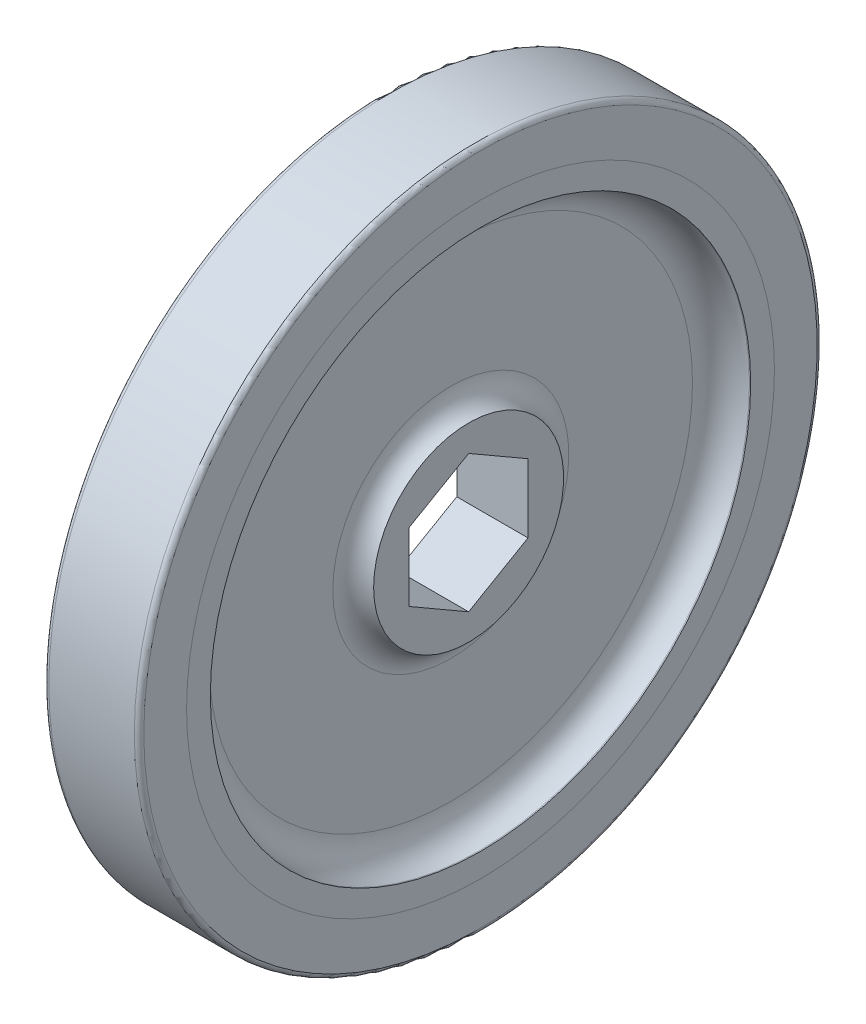
ISO-10303-21;
HEADER;
FILE_DESCRIPTION(('STEP AP214'),'2;1');
FILE_NAME('part.step','',(''),(''),'','','');
FILE_SCHEMA(('AUTOMOTIVE_DESIGN { 1 0 10303 214 1 1 1 1 }'));
ENDSEC;
DATA;
#1=APPLICATION_CONTEXT('core data for automotive mechanical design processes');
#2=APPLICATION_PROTOCOL_DEFINITION('international standard','automotive_design',2000,#1);
#3=PRODUCT_CONTEXT('',#1,'mechanical');
#4=PRODUCT('Part','Part','',(#3));
#5=PRODUCT_RELATED_PRODUCT_CATEGORY('part','',(#4));
#6=PRODUCT_DEFINITION_FORMATION('','',#4);
#7=PRODUCT_DEFINITION_CONTEXT('part definition',#1,'design');
#8=PRODUCT_DEFINITION('design','',#6,#7);
#9=PRODUCT_DEFINITION_SHAPE('','',#8);
#10=(LENGTH_UNIT() NAMED_UNIT(*) SI_UNIT(.MILLI.,.METRE.));
#11=(NAMED_UNIT(*) PLANE_ANGLE_UNIT() SI_UNIT($,.RADIAN.));
#12=(NAMED_UNIT(*) SI_UNIT($,.STERADIAN.) SOLID_ANGLE_UNIT());
#13=UNCERTAINTY_MEASURE_WITH_UNIT(LENGTH_MEASURE(1.E-05),#10,'distance_accuracy_value','');
#14=(GEOMETRIC_REPRESENTATION_CONTEXT(3) GLOBAL_UNCERTAINTY_ASSIGNED_CONTEXT((#13)) GLOBAL_UNIT_ASSIGNED_CONTEXT((#10,
#11,#12)) REPRESENTATION_CONTEXT('',''));
#15=CARTESIAN_POINT('',(0.,0.,0.));
#16=DIRECTION('',(0.,0.,1.));
#17=DIRECTION('',(1.,0.,0.));
#18=AXIS2_PLACEMENT_3D('',#15,#16,#17);
#19=CARTESIAN_POINT('',(-5.08,36.5125,0.));
#20=DIRECTION('',(1.,0.,0.));
#21=DIRECTION('',(0.,0.,-1.));
#22=AXIS2_PLACEMENT_3D('',#19,#20,#21);
#23=PLANE('',#22);
#24=CARTESIAN_POINT('',(-5.08,0.,0.));
#25=DIRECTION('',(1.,0.,0.));
#26=DIRECTION('',(0.,0.,-1.));
#27=AXIS2_PLACEMENT_3D('',#24,#25,#26);
#28=CIRCLE('',#27,36.0045);
#29=CARTESIAN_POINT('',(-5.08,0.,-36.0045));
#30=VERTEX_POINT('',#29);
#31=EDGE_CURVE('E58',#30,#30,#28,.F.);
#32=ORIENTED_EDGE('',*,*,#31,.T.);
#33=EDGE_LOOP('',(#32));
#34=FACE_BOUND('',#33,.T.);
#35=CARTESIAN_POINT('',(-5.08,0.,0.));
#36=DIRECTION('',(-1.,0.,0.));
#37=DIRECTION('',(0.,0.,1.));
#38=AXIS2_PLACEMENT_3D('',#35,#36,#37);
#39=CIRCLE('',#38,31.4325);
#40=CARTESIAN_POINT('',(-5.08,0.,31.4325));
#41=VERTEX_POINT('',#40);
#42=EDGE_CURVE('E63',#41,#41,#39,.T.);
#43=ORIENTED_EDGE('',*,*,#42,.F.);
#44=EDGE_LOOP('',(#43));
#45=FACE_BOUND('',#44,.T.);
#46=ADVANCED_FACE('F43',(#34,#45),#23,.F.);
#47=CARTESIAN_POINT('',(-3.81,0.,0.));
#48=DIRECTION('',(-1.,0.,0.));
#49=DIRECTION('',(0.,0.,1.));
#50=AXIS2_PLACEMENT_3D('',#47,#48,#49);
#51=CYLINDRICAL_SURFACE('',#50,31.4325);
#52=CARTESIAN_POINT('',(-2.54,0.,0.));
#53=DIRECTION('',(-1.,0.,0.));
#54=DIRECTION('',(0.,0.,1.));
#55=AXIS2_PLACEMENT_3D('',#52,#53,#54);
#56=CIRCLE('',#55,31.4325);
#57=CARTESIAN_POINT('',(-2.54,0.,31.4325));
#58=VERTEX_POINT('',#57);
#59=EDGE_CURVE('E66',#58,#58,#56,.T.);
#60=ORIENTED_EDGE('',*,*,#59,.F.);
#61=EDGE_LOOP('',(#60));
#62=FACE_BOUND('',#61,.T.);
#63=ORIENTED_EDGE('',*,*,#42,.T.);
#64=EDGE_LOOP('',(#63));
#65=FACE_BOUND('',#64,.T.);
#66=ADVANCED_FACE('F105',(#62,#65),#51,.F.);
#67=CARTESIAN_POINT('',(-2.54,31.4325,0.));
#68=DIRECTION('',(-1.,0.,0.));
#69=DIRECTION('',(0.,0.,1.));
#70=AXIS2_PLACEMENT_3D('',#67,#68,#69);
#71=PLANE('',#70);
#72=CARTESIAN_POINT('',(-2.54,0.,0.));
#73=DIRECTION('',(-1.,0.,0.));
#74=DIRECTION('',(0.,0.,1.));
#75=AXIS2_PLACEMENT_3D('',#72,#73,#74);
#76=CIRCLE('',#75,33.9725);
#77=CARTESIAN_POINT('',(-2.54,0.,33.9725));
#78=VERTEX_POINT('',#77);
#79=EDGE_CURVE('E69',#78,#78,#76,.T.);
#80=ORIENTED_EDGE('',*,*,#79,.F.);
#81=EDGE_LOOP('',(#80));
#82=FACE_BOUND('',#81,.T.);
#83=ORIENTED_EDGE('',*,*,#59,.T.);
#84=EDGE_LOOP('',(#83));
#85=FACE_BOUND('',#84,.T.);
#86=ADVANCED_FACE('F99',(#82,#85),#71,.F.);
#87=CARTESIAN_POINT('',(-3.81,0.,0.));
#88=DIRECTION('',(-1.,0.,0.));
#89=DIRECTION('',(0.,0.,1.));
#90=AXIS2_PLACEMENT_3D('',#87,#88,#89);
#91=CYLINDRICAL_SURFACE('',#90,33.9725);
#92=CARTESIAN_POINT('',(2.54,0.,0.));
#93=DIRECTION('',(-1.,0.,0.));
#94=DIRECTION('',(0.,0.,1.));
#95=AXIS2_PLACEMENT_3D('',#92,#93,#94);
#96=CIRCLE('',#95,33.9725);
#97=CARTESIAN_POINT('',(2.54,0.,33.9725));
#98=VERTEX_POINT('',#97);
#99=EDGE_CURVE('E72',#98,#98,#96,.T.);
#100=ORIENTED_EDGE('',*,*,#99,.F.);
#101=EDGE_LOOP('',(#100));
#102=FACE_BOUND('',#101,.T.);
#103=ORIENTED_EDGE('',*,*,#79,.T.);
#104=EDGE_LOOP('',(#103));
#105=FACE_BOUND('',#104,.T.);
#106=ADVANCED_FACE('F93',(#102,#105),#91,.F.);
#107=CARTESIAN_POINT('',(2.54,33.9725,0.));
#108=DIRECTION('',(1.,0.,0.));
#109=DIRECTION('',(0.,0.,-1.));
#110=AXIS2_PLACEMENT_3D('',#107,#108,#109);
#111=PLANE('',#110);
#112=CARTESIAN_POINT('',(2.54,0.,0.));
#113=DIRECTION('',(-1.,0.,0.));
#114=DIRECTION('',(0.,0.,1.));
#115=AXIS2_PLACEMENT_3D('',#112,#113,#114);
#116=CIRCLE('',#115,31.4325);
#117=CARTESIAN_POINT('',(2.54,0.,31.4325));
#118=VERTEX_POINT('',#117);
#119=EDGE_CURVE('E75',#118,#118,#116,.T.);
#120=ORIENTED_EDGE('',*,*,#119,.F.);
#121=EDGE_LOOP('',(#120));
#122=FACE_BOUND('',#121,.T.);
#123=ORIENTED_EDGE('',*,*,#99,.T.);
#124=EDGE_LOOP('',(#123));
#125=FACE_BOUND('',#124,.T.);
#126=ADVANCED_FACE('F87',(#122,#125),#111,.F.);
#127=CARTESIAN_POINT('',(-3.81,0.,0.));
#128=DIRECTION('',(-1.,0.,0.));
#129=DIRECTION('',(0.,0.,1.));
#130=AXIS2_PLACEMENT_3D('',#127,#128,#129);
#131=CYLINDRICAL_SURFACE('',#130,31.4325);
#132=CARTESIAN_POINT('',(5.08,0.,0.));
#133=DIRECTION('',(-1.,0.,0.));
#134=DIRECTION('',(0.,0.,1.));
#135=AXIS2_PLACEMENT_3D('',#132,#133,#134);
#136=CIRCLE('',#135,31.4325);
#137=CARTESIAN_POINT('',(5.08,0.,31.4325));
#138=VERTEX_POINT('',#137);
#139=EDGE_CURVE('E78',#138,#138,#136,.T.);
#140=ORIENTED_EDGE('',*,*,#139,.F.);
#141=EDGE_LOOP('',(#140));
#142=FACE_BOUND('',#141,.T.);
#143=ORIENTED_EDGE('',*,*,#119,.T.);
#144=EDGE_LOOP('',(#143));
#145=FACE_BOUND('',#144,.T.);
#146=ADVANCED_FACE('F84',(#142,#145),#131,.F.);
#147=CARTESIAN_POINT('',(5.08,31.4325,0.));
#148=DIRECTION('',(-1.,0.,0.));
#149=DIRECTION('',(0.,0.,1.));
#150=AXIS2_PLACEMENT_3D('',#147,#148,#149);
#151=PLANE('',#150);
#152=CARTESIAN_POINT('',(5.08,0.,0.));
#153=DIRECTION('',(-1.,0.,0.));
#154=DIRECTION('',(0.,0.,1.));
#155=AXIS2_PLACEMENT_3D('',#152,#153,#154);
#156=CIRCLE('',#155,36.0045);
#157=CARTESIAN_POINT('',(5.08,0.,36.0045));
#158=VERTEX_POINT('',#157);
#159=EDGE_CURVE('E11',#158,#158,#156,.F.);
#160=ORIENTED_EDGE('',*,*,#159,.T.);
#161=EDGE_LOOP('',(#160));
#162=FACE_BOUND('',#161,.T.);
#163=ORIENTED_EDGE('',*,*,#139,.T.);
#164=EDGE_LOOP('',(#163));
#165=FACE_BOUND('',#164,.T.);
#166=ADVANCED_FACE('F82',(#162,#165),#151,.F.);
#167=CARTESIAN_POINT('',(-3.81,0.,0.));
#168=DIRECTION('',(-1.,0.,0.));
#169=DIRECTION('',(0.,0.,1.));
#170=AXIS2_PLACEMENT_3D('',#167,#168,#169);
#171=CYLINDRICAL_SURFACE('',#170,36.5125);
#172=CARTESIAN_POINT('',(-4.572,0.,0.));
#173=DIRECTION('',(1.,0.,0.));
#174=DIRECTION('',(0.,0.,-1.));
#175=AXIS2_PLACEMENT_3D('',#172,#173,#174);
#176=CIRCLE('',#175,36.5125);
#177=CARTESIAN_POINT('',(-4.572,0.,-36.5125));
#178=VERTEX_POINT('',#177);
#179=EDGE_CURVE('E50',#178,#178,#176,.T.);
#180=ORIENTED_EDGE('',*,*,#179,.T.);
#181=EDGE_LOOP('',(#180));
#182=FACE_BOUND('',#181,.T.);
#183=CARTESIAN_POINT('',(4.572,0.,0.));
#184=DIRECTION('',(-1.,0.,0.));
#185=DIRECTION('',(0.,0.,1.));
#186=AXIS2_PLACEMENT_3D('',#183,#184,#185);
#187=CIRCLE('',#186,36.5125);
#188=CARTESIAN_POINT('',(4.572,0.,36.5125));
#189=VERTEX_POINT('',#188);
#190=EDGE_CURVE('E54',#189,#189,#187,.T.);
#191=ORIENTED_EDGE('',*,*,#190,.T.);
#192=EDGE_LOOP('',(#191));
#193=FACE_BOUND('',#192,.T.);
#194=ADVANCED_FACE('F121',(#182,#193),#171,.T.);
#195=CARTESIAN_POINT('',(-4.572,0.,0.));
#196=DIRECTION('',(1.,0.,0.));
#197=DIRECTION('',(0.,0.,-1.));
#198=AXIS2_PLACEMENT_3D('',#195,#196,#197);
#199=TOROIDAL_SURFACE('',#198,36.0045,0.508);
#200=ORIENTED_EDGE('',*,*,#179,.F.);
#201=EDGE_LOOP('',(#200));
#202=FACE_BOUND('',#201,.T.);
#203=ORIENTED_EDGE('',*,*,#31,.F.);
#204=EDGE_LOOP('',(#203));
#205=FACE_BOUND('',#204,.T.);
#206=ADVANCED_FACE('F119',(#202,#205),#199,.T.);
#207=CARTESIAN_POINT('',(4.572,0.,0.));
#208=DIRECTION('',(-1.,0.,0.));
#209=DIRECTION('',(0.,0.,1.));
#210=AXIS2_PLACEMENT_3D('',#207,#208,#209);
#211=TOROIDAL_SURFACE('',#210,36.0045,0.508);
#212=ORIENTED_EDGE('',*,*,#159,.F.);
#213=EDGE_LOOP('',(#212));
#214=FACE_BOUND('',#213,.T.);
#215=ORIENTED_EDGE('',*,*,#190,.F.);
#216=EDGE_LOOP('',(#215));
#217=FACE_BOUND('',#216,.T.);
#218=ADVANCED_FACE('F45',(#214,#217),#211,.T.);
#219=CLOSED_SHELL('',(#46,#66,#86,#106,#126,#146,#166,#194,#206,#218));
#220=MANIFOLD_SOLID_BREP('B2',#219);
#221=CARTESIAN_POINT('',(-3.81,10.16,0.));
#222=DIRECTION('',(1.,0.,0.));
#223=DIRECTION('',(0.,0.,-1.));
#224=AXIS2_PLACEMENT_3D('',#221,#222,#223);
#225=PLANE('',#224);
#226=DIRECTION('',(0.,1.,0.));
#227=VECTOR('',#226,1.);
#228=CARTESIAN_POINT('',(-3.81,10.16,-6.35));
#229=LINE('',#228,#227);
#230=CARTESIAN_POINT('',(-3.81,-3.66617420935412,-6.35));
#231=VERTEX_POINT('',#230);
#232=CARTESIAN_POINT('',(-3.81,3.66617420935413,-6.35));
#233=VERTEX_POINT('',#232);
#234=EDGE_CURVE('E302',#231,#233,#229,.T.);
#235=ORIENTED_EDGE('',*,*,#234,.T.);
#236=DIRECTION('',(0.,0.5,0.866025403784439));
#237=VECTOR('',#236,1.);
#238=CARTESIAN_POINT('',(-3.81,8.03926131403119,1.22440905122495));
#239=LINE('',#238,#237);
#240=CARTESIAN_POINT('',(-3.81,7.33234841870825,0.));
#241=VERTEX_POINT('',#240);
#242=EDGE_CURVE('E284',#233,#241,#239,.T.);
#243=ORIENTED_EDGE('',*,*,#242,.T.);
#244=DIRECTION('',(0.,-0.5,0.866025403784439));
#245=VECTOR('',#244,1.);
#246=CARTESIAN_POINT('',(-3.81,8.03926131403119,-1.22440905122495));
#247=LINE('',#246,#245);
#248=CARTESIAN_POINT('',(-3.81,3.66617420935413,6.35));
#249=VERTEX_POINT('',#248);
#250=EDGE_CURVE('E285',#241,#249,#247,.T.);
#251=ORIENTED_EDGE('',*,*,#250,.T.);
#252=DIRECTION('',(0.,-1.,0.));
#253=VECTOR('',#252,1.);
#254=CARTESIAN_POINT('',(-3.81,10.16,6.35));
#255=LINE('',#254,#253);
#256=CARTESIAN_POINT('',(-3.81,-3.66617420935412,6.35));
#257=VERTEX_POINT('',#256);
#258=EDGE_CURVE('E257',#249,#257,#255,.T.);
#259=ORIENTED_EDGE('',*,*,#258,.T.);
#260=DIRECTION('',(0.,-0.5,-0.866025403784439));
#261=VECTOR('',#260,1.);
#262=CARTESIAN_POINT('',(-3.81,-2.95926131403118,7.57440905122495));
#263=LINE('',#262,#261);
#264=CARTESIAN_POINT('',(-3.81,-7.33234841870825,0.));
#265=VERTEX_POINT('',#264);
#266=EDGE_CURVE('E296',#257,#265,#263,.T.);
#267=ORIENTED_EDGE('',*,*,#266,.T.);
#268=DIRECTION('',(0.,0.5,-0.866025403784439));
#269=VECTOR('',#268,1.);
#270=CARTESIAN_POINT('',(-3.81,-2.95926131403119,-7.57440905122495));
#271=LINE('',#270,#269);
#272=EDGE_CURVE('E299',#265,#231,#271,.T.);
#273=ORIENTED_EDGE('',*,*,#272,.T.);
#274=EDGE_LOOP('',(#235,#243,#251,#259,#267,#273));
#275=FACE_BOUND('',#274,.T.);
#276=CARTESIAN_POINT('',(-3.81,0.,0.));
#277=DIRECTION('',(-1.,0.,0.));
#278=DIRECTION('',(0.,0.,1.));
#279=AXIS2_PLACEMENT_3D('',#276,#277,#278);
#280=CIRCLE('',#279,10.16);
#281=CARTESIAN_POINT('',(-3.81,0.,10.16));
#282=VERTEX_POINT('',#281);
#283=EDGE_CURVE('E332',#282,#282,#280,.T.);
#284=ORIENTED_EDGE('',*,*,#283,.T.);
#285=EDGE_LOOP('',(#284));
#286=FACE_BOUND('',#285,.T.);
#287=ADVANCED_FACE('F195',(#275,#286),#225,.F.);
#288=CARTESIAN_POINT('',(3.81,10.16,0.));
#289=DIRECTION('',(-1.,0.,0.));
#290=DIRECTION('',(0.,0.,1.));
#291=AXIS2_PLACEMENT_3D('',#288,#289,#290);
#292=PLANE('',#291);
#293=DIRECTION('',(0.,0.5,-0.866025403784439));
#294=VECTOR('',#293,1.);
#295=CARTESIAN_POINT('',(3.81,8.03926131403119,-1.22440905122495));
#296=LINE('',#295,#294);
#297=CARTESIAN_POINT('',(3.81,3.66617420935413,6.35));
#298=VERTEX_POINT('',#297);
#299=CARTESIAN_POINT('',(3.81,7.33234841870825,0.));
#300=VERTEX_POINT('',#299);
#301=EDGE_CURVE('E245',#298,#300,#296,.T.);
#302=ORIENTED_EDGE('',*,*,#301,.T.);
#303=DIRECTION('',(0.,-0.5,-0.866025403784439));
#304=VECTOR('',#303,1.);
#305=CARTESIAN_POINT('',(3.81,8.03926131403119,1.22440905122495));
#306=LINE('',#305,#304);
#307=CARTESIAN_POINT('',(3.81,3.66617420935413,-6.35));
#308=VERTEX_POINT('',#307);
#309=EDGE_CURVE('E41',#300,#308,#306,.T.);
#310=ORIENTED_EDGE('',*,*,#309,.T.);
#311=DIRECTION('',(0.,-1.,0.));
#312=VECTOR('',#311,1.);
#313=CARTESIAN_POINT('',(3.81,10.16,-6.35));
#314=LINE('',#313,#312);
#315=CARTESIAN_POINT('',(3.81,-3.66617420935412,-6.35));
#316=VERTEX_POINT('',#315);
#317=EDGE_CURVE('E203',#308,#316,#314,.T.);
#318=ORIENTED_EDGE('',*,*,#317,.T.);
#319=DIRECTION('',(0.,-0.5,0.866025403784439));
#320=VECTOR('',#319,1.);
#321=CARTESIAN_POINT('',(3.81,-2.95926131403119,-7.57440905122495));
#322=LINE('',#321,#320);
#323=CARTESIAN_POINT('',(3.81,-7.33234841870825,0.));
#324=VERTEX_POINT('',#323);
#325=EDGE_CURVE('E267',#316,#324,#322,.T.);
#326=ORIENTED_EDGE('',*,*,#325,.T.);
#327=DIRECTION('',(0.,0.5,0.866025403784439));
#328=VECTOR('',#327,1.);
#329=CARTESIAN_POINT('',(3.81,-2.95926131403118,7.57440905122495));
#330=LINE('',#329,#328);
#331=CARTESIAN_POINT('',(3.81,-3.66617420935412,6.35));
#332=VERTEX_POINT('',#331);
#333=EDGE_CURVE('E265',#324,#332,#330,.T.);
#334=ORIENTED_EDGE('',*,*,#333,.T.);
#335=DIRECTION('',(0.,1.,0.));
#336=VECTOR('',#335,1.);
#337=CARTESIAN_POINT('',(3.81,10.16,6.35));
#338=LINE('',#337,#336);
#339=EDGE_CURVE('E249',#332,#298,#338,.T.);
#340=ORIENTED_EDGE('',*,*,#339,.T.);
#341=EDGE_LOOP('',(#302,#310,#318,#326,#334,#340));
#342=FACE_BOUND('',#341,.T.);
#343=CARTESIAN_POINT('',(3.81,0.,0.));
#344=DIRECTION('',(-1.,0.,0.));
#345=DIRECTION('',(0.,0.,1.));
#346=AXIS2_PLACEMENT_3D('',#343,#344,#345);
#347=CIRCLE('',#346,10.16);
#348=CARTESIAN_POINT('',(3.81,0.,10.16));
#349=VERTEX_POINT('',#348);
#350=EDGE_CURVE('E329',#349,#349,#347,.T.);
#351=ORIENTED_EDGE('',*,*,#350,.F.);
#352=EDGE_LOOP('',(#351));
#353=FACE_BOUND('',#352,.T.);
#354=ADVANCED_FACE('F262',(#342,#353),#292,.F.);
#355=CARTESIAN_POINT('',(1.905,28.8925,0.));
#356=DIRECTION('',(-1.,0.,0.));
#357=DIRECTION('',(0.,0.,1.));
#358=AXIS2_PLACEMENT_3D('',#355,#356,#357);
#359=PLANE('',#358);
#360=CARTESIAN_POINT('',(1.905,0.,0.));
#361=DIRECTION('',(-1.,0.,0.));
#362=DIRECTION('',(0.,0.,1.));
#363=AXIS2_PLACEMENT_3D('',#360,#361,#362);
#364=CIRCLE('',#363,25.8445);
#365=CARTESIAN_POINT('',(1.905,0.,25.8445));
#366=VERTEX_POINT('',#365);
#367=EDGE_CURVE('E344',#366,#366,#364,.F.);
#368=ORIENTED_EDGE('',*,*,#367,.T.);
#369=EDGE_LOOP('',(#368));
#370=FACE_BOUND('',#369,.T.);
#371=CARTESIAN_POINT('',(1.905,0.,0.));
#372=DIRECTION('',(-1.,0.,0.));
#373=DIRECTION('',(0.,0.,1.));
#374=AXIS2_PLACEMENT_3D('',#371,#372,#373);
#375=CIRCLE('',#374,12.6193444248417);
#376=CARTESIAN_POINT('',(1.905,0.,12.6193444248417));
#377=VERTEX_POINT('',#376);
#378=EDGE_CURVE('E338',#377,#377,#375,.T.);
#379=ORIENTED_EDGE('',*,*,#378,.T.);
#380=EDGE_LOOP('',(#379));
#381=FACE_BOUND('',#380,.T.);
#382=ADVANCED_FACE('F379',(#370,#381),#359,.F.);
#383=CARTESIAN_POINT('',(-3.81,0.,0.));
#384=DIRECTION('',(-1.,0.,0.));
#385=DIRECTION('',(0.,0.,1.));
#386=AXIS2_PLACEMENT_3D('',#383,#384,#385);
#387=CYLINDRICAL_SURFACE('',#386,28.8925);
#388=CARTESIAN_POINT('',(4.953,0.,0.));
#389=DIRECTION('',(-1.,0.,0.));
#390=DIRECTION('',(0.,0.,1.));
#391=AXIS2_PLACEMENT_3D('',#388,#389,#390);
#392=CIRCLE('',#391,28.8925);
#393=CARTESIAN_POINT('',(4.953,0.,28.8925));
#394=VERTEX_POINT('',#393);
#395=EDGE_CURVE('E341',#394,#394,#392,.T.);
#396=ORIENTED_EDGE('',*,*,#395,.T.);
#397=EDGE_LOOP('',(#396));
#398=FACE_BOUND('',#397,.T.);
#399=CARTESIAN_POINT('',(5.08,0.,0.));
#400=DIRECTION('',(-1.,0.,0.));
#401=DIRECTION('',(0.,0.,1.));
#402=AXIS2_PLACEMENT_3D('',#399,#400,#401);
#403=CIRCLE('',#402,28.8925);
#404=CARTESIAN_POINT('',(5.08,0.,28.8925));
#405=VERTEX_POINT('',#404);
#406=EDGE_CURVE('E326',#405,#405,#403,.T.);
#407=ORIENTED_EDGE('',*,*,#406,.F.);
#408=EDGE_LOOP('',(#407));
#409=FACE_BOUND('',#408,.T.);
#410=ADVANCED_FACE('F393',(#398,#409),#387,.F.);
#411=CARTESIAN_POINT('',(5.08,31.4325,0.));
#412=DIRECTION('',(-1.,0.,0.));
#413=DIRECTION('',(0.,0.,1.));
#414=AXIS2_PLACEMENT_3D('',#411,#412,#413);
#415=PLANE('',#414);
#416=CARTESIAN_POINT('',(5.08,0.,0.));
#417=DIRECTION('',(-1.,0.,0.));
#418=DIRECTION('',(0.,0.,1.));
#419=AXIS2_PLACEMENT_3D('',#416,#417,#418);
#420=CIRCLE('',#419,31.4325);
#421=CARTESIAN_POINT('',(5.08,0.,31.4325));
#422=VERTEX_POINT('',#421);
#423=EDGE_CURVE('E323',#422,#422,#420,.T.);
#424=ORIENTED_EDGE('',*,*,#423,.F.);
#425=EDGE_LOOP('',(#424));
#426=FACE_BOUND('',#425,.T.);
#427=ORIENTED_EDGE('',*,*,#406,.T.);
#428=EDGE_LOOP('',(#427));
#429=FACE_BOUND('',#428,.T.);
#430=ADVANCED_FACE('F396',(#426,#429),#415,.F.);
#431=CARTESIAN_POINT('',(-3.81,0.,0.));
#432=DIRECTION('',(-1.,0.,0.));
#433=DIRECTION('',(0.,0.,1.));
#434=AXIS2_PLACEMENT_3D('',#431,#432,#433);
#435=CYLINDRICAL_SURFACE('',#434,31.4325);
#436=CARTESIAN_POINT('',(2.54,0.,0.));
#437=DIRECTION('',(-1.,0.,0.));
#438=DIRECTION('',(0.,0.,1.));
#439=AXIS2_PLACEMENT_3D('',#436,#437,#438);
#440=CIRCLE('',#439,31.4325);
#441=CARTESIAN_POINT('',(2.54,0.,31.4325));
#442=VERTEX_POINT('',#441);
#443=EDGE_CURVE('E320',#442,#442,#440,.T.);
#444=ORIENTED_EDGE('',*,*,#443,.F.);
#445=EDGE_LOOP('',(#444));
#446=FACE_BOUND('',#445,.T.);
#447=ORIENTED_EDGE('',*,*,#423,.T.);
#448=EDGE_LOOP('',(#447));
#449=FACE_BOUND('',#448,.T.);
#450=ADVANCED_FACE('F401',(#446,#449),#435,.T.);
#451=CARTESIAN_POINT('',(2.54,33.9725,0.));
#452=DIRECTION('',(-1.,0.,0.));
#453=DIRECTION('',(0.,0.,1.));
#454=AXIS2_PLACEMENT_3D('',#451,#452,#453);
#455=PLANE('',#454);
#456=CARTESIAN_POINT('',(2.54,0.,0.));
#457=DIRECTION('',(-1.,0.,0.));
#458=DIRECTION('',(0.,0.,1.));
#459=AXIS2_PLACEMENT_3D('',#456,#457,#458);
#460=CIRCLE('',#459,33.9725);
#461=CARTESIAN_POINT('',(2.54,0.,33.9725));
#462=VERTEX_POINT('',#461);
#463=EDGE_CURVE('E317',#462,#462,#460,.T.);
#464=ORIENTED_EDGE('',*,*,#463,.F.);
#465=EDGE_LOOP('',(#464));
#466=FACE_BOUND('',#465,.T.);
#467=ORIENTED_EDGE('',*,*,#443,.T.);
#468=EDGE_LOOP('',(#467));
#469=FACE_BOUND('',#468,.T.);
#470=ADVANCED_FACE('F407',(#466,#469),#455,.F.);
#471=CARTESIAN_POINT('',(-3.81,0.,0.));
#472=DIRECTION('',(-1.,0.,0.));
#473=DIRECTION('',(0.,0.,1.));
#474=AXIS2_PLACEMENT_3D('',#471,#472,#473);
#475=CYLINDRICAL_SURFACE('',#474,33.9725);
#476=CARTESIAN_POINT('',(-2.54,0.,0.));
#477=DIRECTION('',(-1.,0.,0.));
#478=DIRECTION('',(0.,0.,1.));
#479=AXIS2_PLACEMENT_3D('',#476,#477,#478);
#480=CIRCLE('',#479,33.9725);
#481=CARTESIAN_POINT('',(-2.54,0.,33.9725));
#482=VERTEX_POINT('',#481);
#483=EDGE_CURVE('E314',#482,#482,#480,.T.);
#484=ORIENTED_EDGE('',*,*,#483,.F.);
#485=EDGE_LOOP('',(#484));
#486=FACE_BOUND('',#485,.T.);
#487=ORIENTED_EDGE('',*,*,#463,.T.);
#488=EDGE_LOOP('',(#487));
#489=FACE_BOUND('',#488,.T.);
#490=ADVANCED_FACE('F530',(#486,#489),#475,.T.);
#491=CARTESIAN_POINT('',(-2.54,33.9725,0.));
#492=DIRECTION('',(1.,0.,0.));
#493=DIRECTION('',(0.,0.,-1.));
#494=AXIS2_PLACEMENT_3D('',#491,#492,#493);
#495=PLANE('',#494);
#496=CARTESIAN_POINT('',(-2.54,0.,0.));
#497=DIRECTION('',(-1.,0.,0.));
#498=DIRECTION('',(0.,0.,1.));
#499=AXIS2_PLACEMENT_3D('',#496,#497,#498);
#500=CIRCLE('',#499,31.4325);
#501=CARTESIAN_POINT('',(-2.54,0.,31.4325));
#502=VERTEX_POINT('',#501);
#503=EDGE_CURVE('E311',#502,#502,#500,.T.);
#504=ORIENTED_EDGE('',*,*,#503,.F.);
#505=EDGE_LOOP('',(#504));
#506=FACE_BOUND('',#505,.T.);
#507=ORIENTED_EDGE('',*,*,#483,.T.);
#508=EDGE_LOOP('',(#507));
#509=FACE_BOUND('',#508,.T.);
#510=ADVANCED_FACE('F526',(#506,#509),#495,.F.);
#511=CARTESIAN_POINT('',(-3.81,0.,0.));
#512=DIRECTION('',(-1.,0.,0.));
#513=DIRECTION('',(0.,0.,1.));
#514=AXIS2_PLACEMENT_3D('',#511,#512,#513);
#515=CYLINDRICAL_SURFACE('',#514,31.4325);
#516=CARTESIAN_POINT('',(-5.08,0.,0.));
#517=DIRECTION('',(-1.,0.,0.));
#518=DIRECTION('',(0.,0.,1.));
#519=AXIS2_PLACEMENT_3D('',#516,#517,#518);
#520=CIRCLE('',#519,31.4325);
#521=CARTESIAN_POINT('',(-5.08,0.,31.4325));
#522=VERTEX_POINT('',#521);
#523=EDGE_CURVE('E308',#522,#522,#520,.T.);
#524=ORIENTED_EDGE('',*,*,#523,.F.);
#525=EDGE_LOOP('',(#524));
#526=FACE_BOUND('',#525,.T.);
#527=ORIENTED_EDGE('',*,*,#503,.T.);
#528=EDGE_LOOP('',(#527));
#529=FACE_BOUND('',#528,.T.);
#530=ADVANCED_FACE('F522',(#526,#529),#515,.T.);
#531=CARTESIAN_POINT('',(-5.08,31.4325,0.));
#532=DIRECTION('',(1.,0.,0.));
#533=DIRECTION('',(0.,0.,-1.));
#534=AXIS2_PLACEMENT_3D('',#531,#532,#533);
#535=PLANE('',#534);
#536=CARTESIAN_POINT('',(-5.08,0.,0.));
#537=DIRECTION('',(-1.,0.,0.));
#538=DIRECTION('',(0.,0.,1.));
#539=AXIS2_PLACEMENT_3D('',#536,#537,#538);
#540=CIRCLE('',#539,28.8925);
#541=CARTESIAN_POINT('',(-5.08,0.,28.8925));
#542=VERTEX_POINT('',#541);
#543=EDGE_CURVE('E305',#542,#542,#540,.T.);
#544=ORIENTED_EDGE('',*,*,#543,.F.);
#545=EDGE_LOOP('',(#544));
#546=FACE_BOUND('',#545,.T.);
#547=ORIENTED_EDGE('',*,*,#523,.T.);
#548=EDGE_LOOP('',(#547));
#549=FACE_BOUND('',#548,.T.);
#550=ADVANCED_FACE('F436',(#546,#549),#535,.F.);
#551=CARTESIAN_POINT('',(-3.81,0.,0.));
#552=DIRECTION('',(-1.,0.,0.));
#553=DIRECTION('',(0.,0.,1.));
#554=AXIS2_PLACEMENT_3D('',#551,#552,#553);
#555=CYLINDRICAL_SURFACE('',#554,28.8925);
#556=CARTESIAN_POINT('',(-4.953,0.,0.));
#557=DIRECTION('',(1.,0.,0.));
#558=DIRECTION('',(0.,0.,-1.));
#559=AXIS2_PLACEMENT_3D('',#556,#557,#558);
#560=CIRCLE('',#559,28.8925);
#561=CARTESIAN_POINT('',(-4.953,0.,-28.8925));
#562=VERTEX_POINT('',#561);
#563=EDGE_CURVE('E250',#562,#562,#560,.T.);
#564=ORIENTED_EDGE('',*,*,#563,.T.);
#565=EDGE_LOOP('',(#564));
#566=FACE_BOUND('',#565,.T.);
#567=ORIENTED_EDGE('',*,*,#543,.T.);
#568=EDGE_LOOP('',(#567));
#569=FACE_BOUND('',#568,.T.);
#570=ADVANCED_FACE('F352',(#566,#569),#555,.F.);
#571=CARTESIAN_POINT('',(-1.905,28.8925,0.));
#572=DIRECTION('',(1.,0.,0.));
#573=DIRECTION('',(0.,0.,-1.));
#574=AXIS2_PLACEMENT_3D('',#571,#572,#573);
#575=PLANE('',#574);
#576=CARTESIAN_POINT('',(-1.905,0.,0.));
#577=DIRECTION('',(1.,0.,0.));
#578=DIRECTION('',(0.,0.,-1.));
#579=AXIS2_PLACEMENT_3D('',#576,#577,#578);
#580=CIRCLE('',#579,25.8445);
#581=CARTESIAN_POINT('',(-1.905,0.,-25.8445));
#582=VERTEX_POINT('',#581);
#583=EDGE_CURVE('E347',#582,#582,#580,.F.);
#584=ORIENTED_EDGE('',*,*,#583,.T.);
#585=EDGE_LOOP('',(#584));
#586=FACE_BOUND('',#585,.T.);
#587=CARTESIAN_POINT('',(-1.905,0.,0.));
#588=DIRECTION('',(1.,0.,0.));
#589=DIRECTION('',(0.,0.,-1.));
#590=AXIS2_PLACEMENT_3D('',#587,#588,#589);
#591=CIRCLE('',#590,12.6193444248417);
#592=CARTESIAN_POINT('',(-1.905,0.,-12.6193444248417));
#593=VERTEX_POINT('',#592);
#594=EDGE_CURVE('E335',#593,#593,#591,.T.);
#595=ORIENTED_EDGE('',*,*,#594,.T.);
#596=EDGE_LOOP('',(#595));
#597=FACE_BOUND('',#596,.T.);
#598=ADVANCED_FACE('F360',(#586,#597),#575,.F.);
#599=CARTESIAN_POINT('',(-4.445,0.,0.));
#600=DIRECTION('',(1.,0.,0.));
#601=DIRECTION('',(0.,0.,-1.));
#602=AXIS2_PLACEMENT_3D('',#599,#600,#601);
#603=TOROIDAL_SURFACE('',#602,12.6193444248417,2.54);
#604=ORIENTED_EDGE('',*,*,#594,.F.);
#605=EDGE_LOOP('',(#604));
#606=FACE_BOUND('',#605,.T.);
#607=ORIENTED_EDGE('',*,*,#283,.F.);
#608=EDGE_LOOP('',(#607));
#609=FACE_BOUND('',#608,.T.);
#610=ADVANCED_FACE('F363',(#606,#609),#603,.F.);
#611=CARTESIAN_POINT('',(4.445,0.,0.));
#612=DIRECTION('',(-1.,0.,0.));
#613=DIRECTION('',(0.,0.,1.));
#614=AXIS2_PLACEMENT_3D('',#611,#612,#613);
#615=TOROIDAL_SURFACE('',#614,12.6193444248417,2.54);
#616=ORIENTED_EDGE('',*,*,#350,.T.);
#617=EDGE_LOOP('',(#616));
#618=FACE_BOUND('',#617,.T.);
#619=ORIENTED_EDGE('',*,*,#378,.F.);
#620=EDGE_LOOP('',(#619));
#621=FACE_BOUND('',#620,.T.);
#622=ADVANCED_FACE('F369',(#618,#621),#615,.F.);
#623=CARTESIAN_POINT('',(4.953,0.,0.));
#624=DIRECTION('',(-1.,0.,0.));
#625=DIRECTION('',(0.,0.,1.));
#626=AXIS2_PLACEMENT_3D('',#623,#624,#625);
#627=TOROIDAL_SURFACE('',#626,25.8445,3.048);
#628=ORIENTED_EDGE('',*,*,#367,.F.);
#629=EDGE_LOOP('',(#628));
#630=FACE_BOUND('',#629,.T.);
#631=ORIENTED_EDGE('',*,*,#395,.F.);
#632=EDGE_LOOP('',(#631));
#633=FACE_BOUND('',#632,.T.);
#634=ADVANCED_FACE('F357',(#630,#633),#627,.F.);
#635=CARTESIAN_POINT('',(-4.953,0.,0.));
#636=DIRECTION('',(1.,0.,0.));
#637=DIRECTION('',(0.,0.,-1.));
#638=AXIS2_PLACEMENT_3D('',#635,#636,#637);
#639=TOROIDAL_SURFACE('',#638,25.8445,3.048);
#640=ORIENTED_EDGE('',*,*,#563,.F.);
#641=EDGE_LOOP('',(#640));
#642=FACE_BOUND('',#641,.T.);
#643=ORIENTED_EDGE('',*,*,#583,.F.);
#644=EDGE_LOOP('',(#643));
#645=FACE_BOUND('',#644,.T.);
#646=ADVANCED_FACE('F197',(#642,#645),#639,.F.);
#647=CARTESIAN_POINT('',(-5.08,3.66617420935413,-6.35));
#648=DIRECTION('',(0.,0.866025403784439,-0.5));
#649=DIRECTION('',(0.,0.5,0.866025403784439));
#650=AXIS2_PLACEMENT_3D('',#647,#648,#649);
#651=PLANE('',#650);
#652=DIRECTION('',(1.,0.,0.));
#653=VECTOR('',#652,1.);
#654=CARTESIAN_POINT('',(-5.08,3.66617420935413,-6.35));
#655=LINE('',#654,#653);
#656=EDGE_CURVE('E277',#233,#308,#655,.T.);
#657=ORIENTED_EDGE('',*,*,#656,.T.);
#658=ORIENTED_EDGE('',*,*,#309,.F.);
#659=DIRECTION('',(1.,0.,0.));
#660=VECTOR('',#659,1.);
#661=CARTESIAN_POINT('',(-5.08,7.33234841870825,0.));
#662=LINE('',#661,#660);
#663=EDGE_CURVE('E215',#241,#300,#662,.T.);
#664=ORIENTED_EDGE('',*,*,#663,.F.);
#665=ORIENTED_EDGE('',*,*,#242,.F.);
#666=EDGE_LOOP('',(#657,#658,#664,#665));
#667=FACE_BOUND('',#666,.T.);
#668=ADVANCED_FACE('F282',(#667),#651,.F.);
#669=CARTESIAN_POINT('',(-5.08,-3.66617420935412,-6.35));
#670=DIRECTION('',(0.,0.,-1.));
#671=DIRECTION('',(0.,1.,0.));
#672=AXIS2_PLACEMENT_3D('',#669,#670,#671);
#673=PLANE('',#672);
#674=DIRECTION('',(1.,0.,0.));
#675=VECTOR('',#674,1.);
#676=CARTESIAN_POINT('',(-5.08,-3.66617420935412,-6.35));
#677=LINE('',#676,#675);
#678=EDGE_CURVE('E280',#231,#316,#677,.T.);
#679=ORIENTED_EDGE('',*,*,#678,.T.);
#680=ORIENTED_EDGE('',*,*,#317,.F.);
#681=ORIENTED_EDGE('',*,*,#656,.F.);
#682=ORIENTED_EDGE('',*,*,#234,.F.);
#683=EDGE_LOOP('',(#679,#680,#681,#682));
#684=FACE_BOUND('',#683,.T.);
#685=ADVANCED_FACE('F276',(#684),#673,.F.);
#686=CARTESIAN_POINT('',(-5.08,-7.33234841870825,0.));
#687=DIRECTION('',(0.,-0.866025403784439,-0.5));
#688=DIRECTION('',(0.,0.5,-0.866025403784439));
#689=AXIS2_PLACEMENT_3D('',#686,#687,#688);
#690=PLANE('',#689);
#691=DIRECTION('',(1.,0.,0.));
#692=VECTOR('',#691,1.);
#693=CARTESIAN_POINT('',(-5.08,-7.33234841870825,0.));
#694=LINE('',#693,#692);
#695=EDGE_CURVE('E288',#265,#324,#694,.T.);
#696=ORIENTED_EDGE('',*,*,#695,.T.);
#697=ORIENTED_EDGE('',*,*,#325,.F.);
#698=ORIENTED_EDGE('',*,*,#678,.F.);
#699=ORIENTED_EDGE('',*,*,#272,.F.);
#700=EDGE_LOOP('',(#696,#697,#698,#699));
#701=FACE_BOUND('',#700,.T.);
#702=ADVANCED_FACE('F481',(#701),#690,.F.);
#703=CARTESIAN_POINT('',(-5.08,-3.66617420935412,6.35));
#704=DIRECTION('',(0.,-0.866025403784439,0.5));
#705=DIRECTION('',(0.,-0.5,-0.866025403784439));
#706=AXIS2_PLACEMENT_3D('',#703,#704,#705);
#707=PLANE('',#706);
#708=DIRECTION('',(1.,0.,0.));
#709=VECTOR('',#708,1.);
#710=CARTESIAN_POINT('',(-5.08,-3.66617420935412,6.35));
#711=LINE('',#710,#709);
#712=EDGE_CURVE('E259',#257,#332,#711,.T.);
#713=ORIENTED_EDGE('',*,*,#712,.T.);
#714=ORIENTED_EDGE('',*,*,#333,.F.);
#715=ORIENTED_EDGE('',*,*,#695,.F.);
#716=ORIENTED_EDGE('',*,*,#266,.F.);
#717=EDGE_LOOP('',(#713,#714,#715,#716));
#718=FACE_BOUND('',#717,.T.);
#719=ADVANCED_FACE('F490',(#718),#707,.F.);
#720=CARTESIAN_POINT('',(-5.08,3.66617420935413,6.35));
#721=DIRECTION('',(0.,0.,1.));
#722=DIRECTION('',(1.,0.,0.));
#723=AXIS2_PLACEMENT_3D('',#720,#721,#722);
#724=PLANE('',#723);
#725=DIRECTION('',(1.,0.,0.));
#726=VECTOR('',#725,1.);
#727=CARTESIAN_POINT('',(-5.08,3.66617420935413,6.35));
#728=LINE('',#727,#726);
#729=EDGE_CURVE('E210',#249,#298,#728,.T.);
#730=ORIENTED_EDGE('',*,*,#729,.T.);
#731=ORIENTED_EDGE('',*,*,#339,.F.);
#732=ORIENTED_EDGE('',*,*,#712,.F.);
#733=ORIENTED_EDGE('',*,*,#258,.F.);
#734=EDGE_LOOP('',(#730,#731,#732,#733));
#735=FACE_BOUND('',#734,.T.);
#736=ADVANCED_FACE('F253',(#735),#724,.F.);
#737=CARTESIAN_POINT('',(-5.08,7.33234841870825,0.));
#738=DIRECTION('',(0.,0.866025403784439,0.5));
#739=DIRECTION('',(0.,-0.5,0.866025403784439));
#740=AXIS2_PLACEMENT_3D('',#737,#738,#739);
#741=PLANE('',#740);
#742=ORIENTED_EDGE('',*,*,#663,.T.);
#743=ORIENTED_EDGE('',*,*,#301,.F.);
#744=ORIENTED_EDGE('',*,*,#729,.F.);
#745=ORIENTED_EDGE('',*,*,#250,.F.);
#746=EDGE_LOOP('',(#742,#743,#744,#745));
#747=FACE_BOUND('',#746,.T.);
#748=ADVANCED_FACE('F246',(#747),#741,.F.);
#749=CLOSED_SHELL('',(#287,#354,#382,#410,#430,#450,#470,#490,#510,#530,#550,#570,#598,#610,
#622,#634,#646,#668,#685,#702,#719,#736,#748));
#750=MANIFOLD_SOLID_BREP('B6',#749);
#751=ADVANCED_BREP_SHAPE_REPRESENTATION('',(#18,#220,#750),#14);
#752=SHAPE_DEFINITION_REPRESENTATION(#9,#751);
ENDSEC;
END-ISO-10303-21;
